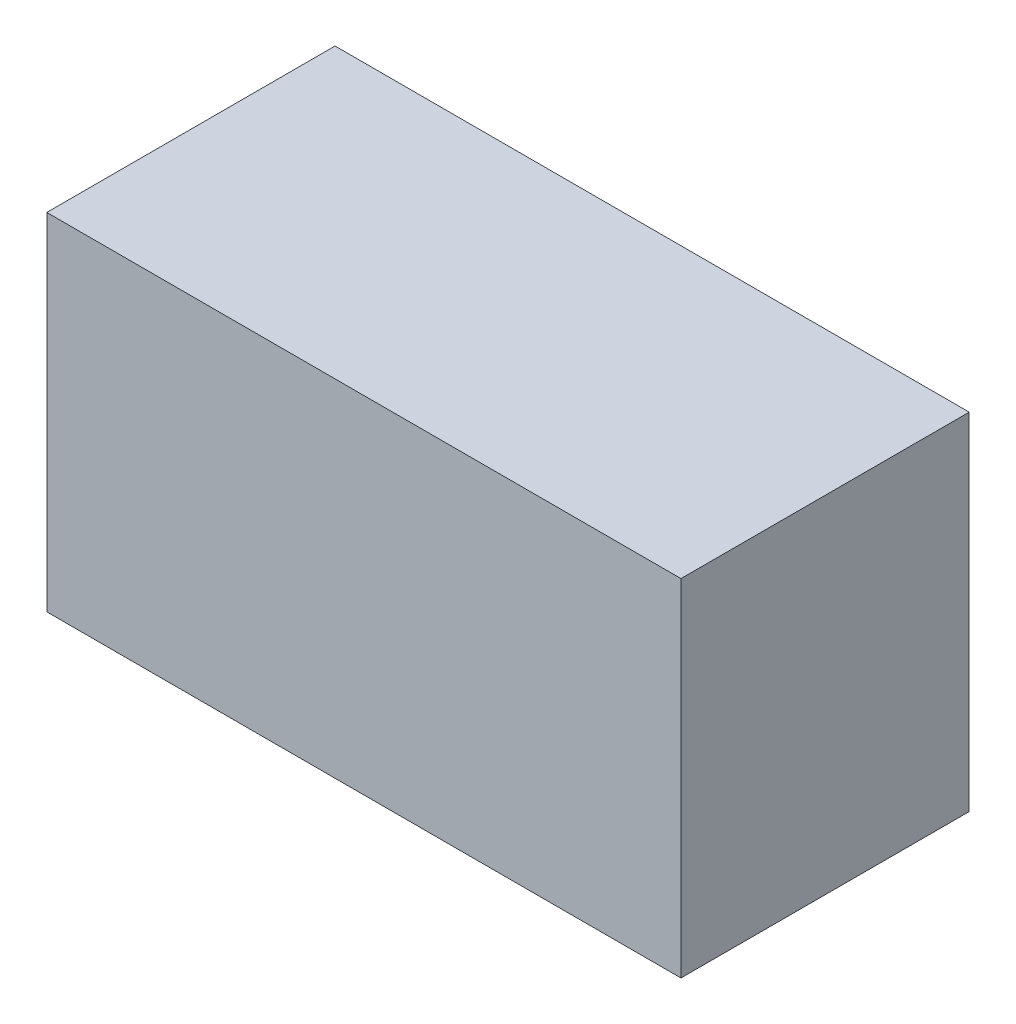
ISO-10303-21;
HEADER;
FILE_DESCRIPTION(('STEP AP214'),'2;1');
FILE_NAME('part.step','',(''),(''),'','','');
FILE_SCHEMA(('AUTOMOTIVE_DESIGN { 1 0 10303 214 1 1 1 1 }'));
ENDSEC;
DATA;
#1=APPLICATION_CONTEXT('core data for automotive mechanical design processes');
#2=APPLICATION_PROTOCOL_DEFINITION('international standard','automotive_design',2000,#1);
#3=PRODUCT_CONTEXT('',#1,'mechanical');
#4=PRODUCT('Part','Part','',(#3));
#5=PRODUCT_RELATED_PRODUCT_CATEGORY('part','',(#4));
#6=PRODUCT_DEFINITION_FORMATION('','',#4);
#7=PRODUCT_DEFINITION_CONTEXT('part definition',#1,'design');
#8=PRODUCT_DEFINITION('design','',#6,#7);
#9=PRODUCT_DEFINITION_SHAPE('','',#8);
#10=(LENGTH_UNIT() NAMED_UNIT(*) SI_UNIT(.MILLI.,.METRE.));
#11=(NAMED_UNIT(*) PLANE_ANGLE_UNIT() SI_UNIT($,.RADIAN.));
#12=(NAMED_UNIT(*) SI_UNIT($,.STERADIAN.) SOLID_ANGLE_UNIT());
#13=UNCERTAINTY_MEASURE_WITH_UNIT(LENGTH_MEASURE(1.E-05),#10,'distance_accuracy_value','');
#14=(GEOMETRIC_REPRESENTATION_CONTEXT(3) GLOBAL_UNCERTAINTY_ASSIGNED_CONTEXT((#13)) GLOBAL_UNIT_ASSIGNED_CONTEXT((#10,
#11,#12)) REPRESENTATION_CONTEXT('',''));
#15=CARTESIAN_POINT('',(0.,0.,0.));
#16=DIRECTION('',(0.,0.,1.));
#17=DIRECTION('',(1.,0.,0.));
#18=AXIS2_PLACEMENT_3D('',#15,#16,#17);
#19=CARTESIAN_POINT('',(5.5,-3.,5.));
#20=DIRECTION('',(-1.,0.,0.));
#21=DIRECTION('',(0.,0.,1.));
#22=AXIS2_PLACEMENT_3D('',#19,#20,#21);
#23=PLANE('',#22);
#24=DIRECTION('',(0.,1.,0.));
#25=VECTOR('',#24,1.);
#26=CARTESIAN_POINT('',(5.5,-3.,0.));
#27=LINE('',#26,#25);
#28=CARTESIAN_POINT('',(5.5,-3.,0.));
#29=VERTEX_POINT('',#28);
#30=CARTESIAN_POINT('',(5.5,3.,0.));
#31=VERTEX_POINT('',#30);
#32=EDGE_CURVE('E96',#29,#31,#27,.T.);
#33=ORIENTED_EDGE('',*,*,#32,.T.);
#34=DIRECTION('',(0.,0.,-1.));
#35=VECTOR('',#34,1.);
#36=CARTESIAN_POINT('',(5.5,3.,5.));
#37=LINE('',#36,#35);
#38=CARTESIAN_POINT('',(5.5,3.,5.));
#39=VERTEX_POINT('',#38);
#40=EDGE_CURVE('E11',#39,#31,#37,.T.);
#41=ORIENTED_EDGE('',*,*,#40,.F.);
#42=DIRECTION('',(0.,1.,0.));
#43=VECTOR('',#42,1.);
#44=CARTESIAN_POINT('',(5.5,-3.,5.));
#45=LINE('',#44,#43);
#46=CARTESIAN_POINT('',(5.5,-3.,5.));
#47=VERTEX_POINT('',#46);
#48=EDGE_CURVE('E84',#47,#39,#45,.T.);
#49=ORIENTED_EDGE('',*,*,#48,.F.);
#50=DIRECTION('',(0.,0.,-1.));
#51=VECTOR('',#50,1.);
#52=CARTESIAN_POINT('',(5.5,-3.,5.));
#53=LINE('',#52,#51);
#54=EDGE_CURVE('E92',#47,#29,#53,.T.);
#55=ORIENTED_EDGE('',*,*,#54,.T.);
#56=EDGE_LOOP('',(#33,#41,#49,#55));
#57=FACE_BOUND('',#56,.T.);
#58=ADVANCED_FACE('F33',(#57),#23,.F.);
#59=CARTESIAN_POINT('',(-5.5,3.,5.));
#60=DIRECTION('',(0.,-1.,0.));
#61=DIRECTION('',(0.,0.,-1.));
#62=AXIS2_PLACEMENT_3D('',#59,#60,#61);
#63=PLANE('',#62);
#64=DIRECTION('',(-1.,0.,0.));
#65=VECTOR('',#64,1.);
#66=CARTESIAN_POINT('',(-5.5,3.,0.));
#67=LINE('',#66,#65);
#68=CARTESIAN_POINT('',(-5.5,3.,0.));
#69=VERTEX_POINT('',#68);
#70=EDGE_CURVE('E88',#31,#69,#67,.T.);
#71=ORIENTED_EDGE('',*,*,#70,.T.);
#72=DIRECTION('',(0.,0.,-1.));
#73=VECTOR('',#72,1.);
#74=CARTESIAN_POINT('',(-5.5,3.,5.));
#75=LINE('',#74,#73);
#76=CARTESIAN_POINT('',(-5.5,3.,5.));
#77=VERTEX_POINT('',#76);
#78=EDGE_CURVE('E41',#77,#69,#75,.T.);
#79=ORIENTED_EDGE('',*,*,#78,.F.);
#80=DIRECTION('',(-1.,0.,0.));
#81=VECTOR('',#80,1.);
#82=CARTESIAN_POINT('',(-5.5,3.,5.));
#83=LINE('',#82,#81);
#84=EDGE_CURVE('E79',#39,#77,#83,.T.);
#85=ORIENTED_EDGE('',*,*,#84,.F.);
#86=ORIENTED_EDGE('',*,*,#40,.T.);
#87=EDGE_LOOP('',(#71,#79,#85,#86));
#88=FACE_BOUND('',#87,.T.);
#89=ADVANCED_FACE('F87',(#88),#63,.F.);
#90=CARTESIAN_POINT('',(-5.5,-3.,5.));
#91=DIRECTION('',(1.,0.,0.));
#92=DIRECTION('',(0.,0.,-1.));
#93=AXIS2_PLACEMENT_3D('',#90,#91,#92);
#94=PLANE('',#93);
#95=DIRECTION('',(0.,-1.,0.));
#96=VECTOR('',#95,1.);
#97=CARTESIAN_POINT('',(-5.5,-3.,0.));
#98=LINE('',#97,#96);
#99=CARTESIAN_POINT('',(-5.5,-3.,0.));
#100=VERTEX_POINT('',#99);
#101=EDGE_CURVE('E66',#69,#100,#98,.T.);
#102=ORIENTED_EDGE('',*,*,#101,.T.);
#103=DIRECTION('',(0.,0.,-1.));
#104=VECTOR('',#103,1.);
#105=CARTESIAN_POINT('',(-5.5,-3.,5.));
#106=LINE('',#105,#104);
#107=CARTESIAN_POINT('',(-5.5,-3.,5.));
#108=VERTEX_POINT('',#107);
#109=EDGE_CURVE('E89',#108,#100,#106,.T.);
#110=ORIENTED_EDGE('',*,*,#109,.F.);
#111=DIRECTION('',(0.,-1.,0.));
#112=VECTOR('',#111,1.);
#113=CARTESIAN_POINT('',(-5.5,-3.,5.));
#114=LINE('',#113,#112);
#115=EDGE_CURVE('E82',#77,#108,#114,.T.);
#116=ORIENTED_EDGE('',*,*,#115,.F.);
#117=ORIENTED_EDGE('',*,*,#78,.T.);
#118=EDGE_LOOP('',(#102,#110,#116,#117));
#119=FACE_BOUND('',#118,.T.);
#120=ADVANCED_FACE('F90',(#119),#94,.F.);
#121=CARTESIAN_POINT('',(-5.5,-3.,5.));
#122=DIRECTION('',(0.,1.,0.));
#123=DIRECTION('',(-1.,0.,0.));
#124=AXIS2_PLACEMENT_3D('',#121,#122,#123);
#125=PLANE('',#124);
#126=DIRECTION('',(1.,0.,0.));
#127=VECTOR('',#126,1.);
#128=CARTESIAN_POINT('',(-5.5,-3.,0.));
#129=LINE('',#128,#127);
#130=EDGE_CURVE('E72',#100,#29,#129,.T.);
#131=ORIENTED_EDGE('',*,*,#130,.T.);
#132=ORIENTED_EDGE('',*,*,#54,.F.);
#133=DIRECTION('',(1.,0.,0.));
#134=VECTOR('',#133,1.);
#135=CARTESIAN_POINT('',(-5.5,-3.,5.));
#136=LINE('',#135,#134);
#137=EDGE_CURVE('E49',#108,#47,#136,.T.);
#138=ORIENTED_EDGE('',*,*,#137,.F.);
#139=ORIENTED_EDGE('',*,*,#109,.T.);
#140=EDGE_LOOP('',(#131,#132,#138,#139));
#141=FACE_BOUND('',#140,.T.);
#142=ADVANCED_FACE('F103',(#141),#125,.F.);
#143=CARTESIAN_POINT('',(0.,0.,5.));
#144=DIRECTION('',(0.,0.,-1.));
#145=DIRECTION('',(-1.,0.,0.));
#146=AXIS2_PLACEMENT_3D('',#143,#144,#145);
#147=PLANE('',#146);
#148=ORIENTED_EDGE('',*,*,#48,.T.);
#149=ORIENTED_EDGE('',*,*,#84,.T.);
#150=ORIENTED_EDGE('',*,*,#115,.T.);
#151=ORIENTED_EDGE('',*,*,#137,.T.);
#152=EDGE_LOOP('',(#148,#149,#150,#151));
#153=FACE_BOUND('',#152,.T.);
#154=ADVANCED_FACE('F80',(#153),#147,.F.);
#155=CARTESIAN_POINT('',(0.,0.,0.));
#156=DIRECTION('',(0.,0.,-1.));
#157=DIRECTION('',(-1.,0.,0.));
#158=AXIS2_PLACEMENT_3D('',#155,#156,#157);
#159=PLANE('',#158);
#160=ORIENTED_EDGE('',*,*,#32,.F.);
#161=ORIENTED_EDGE('',*,*,#130,.F.);
#162=ORIENTED_EDGE('',*,*,#101,.F.);
#163=ORIENTED_EDGE('',*,*,#70,.F.);
#164=EDGE_LOOP('',(#160,#161,#162,#163));
#165=FACE_BOUND('',#164,.T.);
#166=ADVANCED_FACE('F106',(#165),#159,.T.);
#167=CLOSED_SHELL('',(#58,#89,#120,#142,#154,#166));
#168=MANIFOLD_SOLID_BREP('B2',#167);
#169=ADVANCED_BREP_SHAPE_REPRESENTATION('',(#18,#168),#14);
#170=SHAPE_DEFINITION_REPRESENTATION(#9,#169);
ENDSEC;
END-ISO-10303-21;
